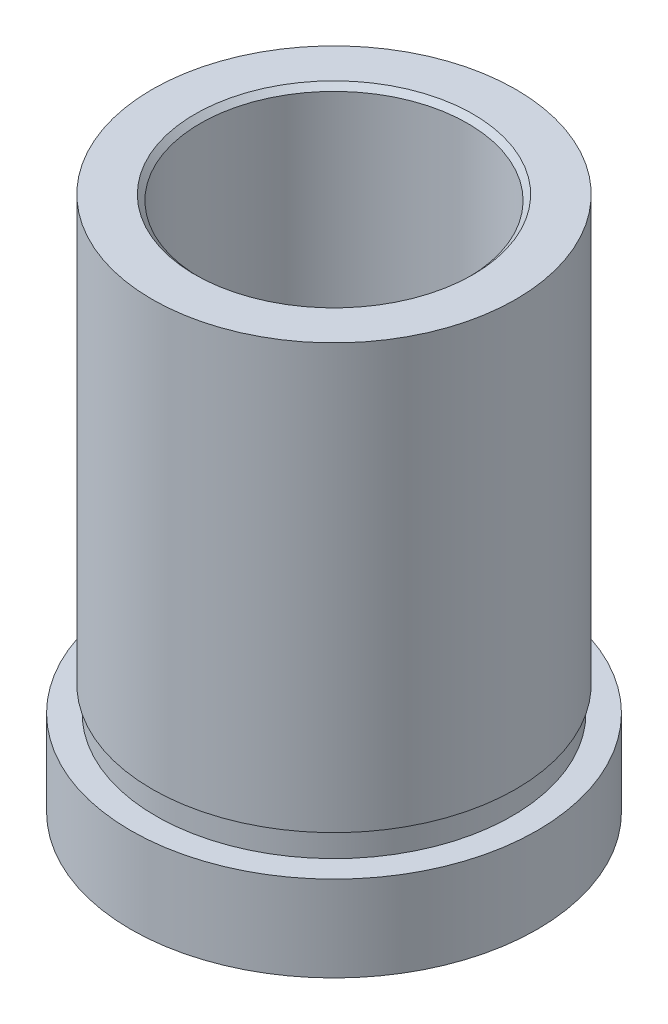
ISO-10303-21;
HEADER;
FILE_DESCRIPTION(('STEP AP214'),'2;1');
FILE_NAME('part.step','',(''),(''),'','','');
FILE_SCHEMA(('AUTOMOTIVE_DESIGN { 1 0 10303 214 1 1 1 1 }'));
ENDSEC;
DATA;
#1=APPLICATION_CONTEXT('core data for automotive mechanical design processes');
#2=APPLICATION_PROTOCOL_DEFINITION('international standard','automotive_design',2000,#1);
#3=PRODUCT_CONTEXT('',#1,'mechanical');
#4=PRODUCT('Part','Part','',(#3));
#5=PRODUCT_RELATED_PRODUCT_CATEGORY('part','',(#4));
#6=PRODUCT_DEFINITION_FORMATION('','',#4);
#7=PRODUCT_DEFINITION_CONTEXT('part definition',#1,'design');
#8=PRODUCT_DEFINITION('design','',#6,#7);
#9=PRODUCT_DEFINITION_SHAPE('','',#8);
#10=(LENGTH_UNIT() NAMED_UNIT(*) SI_UNIT(.MILLI.,.METRE.));
#11=(NAMED_UNIT(*) PLANE_ANGLE_UNIT() SI_UNIT($,.RADIAN.));
#12=(NAMED_UNIT(*) SI_UNIT($,.STERADIAN.) SOLID_ANGLE_UNIT());
#13=UNCERTAINTY_MEASURE_WITH_UNIT(LENGTH_MEASURE(1.E-05),#10,'distance_accuracy_value','');
#14=(GEOMETRIC_REPRESENTATION_CONTEXT(3) GLOBAL_UNCERTAINTY_ASSIGNED_CONTEXT((#13)) GLOBAL_UNIT_ASSIGNED_CONTEXT((#10,
#11,#12)) REPRESENTATION_CONTEXT('',''));
#15=CARTESIAN_POINT('',(0.,0.,0.));
#16=DIRECTION('',(0.,0.,1.));
#17=DIRECTION('',(1.,0.,0.));
#18=AXIS2_PLACEMENT_3D('',#15,#16,#17);
#19=CARTESIAN_POINT('',(0.,50.,0.));
#20=DIRECTION('',(0.,-1.,0.));
#21=DIRECTION('',(1.,0.,0.));
#22=AXIS2_PLACEMENT_3D('',#19,#20,#21);
#23=CYLINDRICAL_SURFACE('',#22,12.5);
#24=CARTESIAN_POINT('',(0.,49.5,0.));
#25=DIRECTION('',(0.,-1.,0.));
#26=DIRECTION('',(1.,0.,0.));
#27=AXIS2_PLACEMENT_3D('',#24,#25,#26);
#28=CIRCLE('',#27,12.5);
#29=CARTESIAN_POINT('',(12.5,49.5,0.));
#30=VERTEX_POINT('',#29);
#31=EDGE_CURVE('E10',#30,#30,#28,.F.);
#32=ORIENTED_EDGE('',*,*,#31,.T.);
#33=EDGE_LOOP('',(#32));
#34=FACE_BOUND('',#33,.T.);
#35=CARTESIAN_POINT('',(0.,16.,0.));
#36=DIRECTION('',(0.,-1.,0.));
#37=DIRECTION('',(1.,0.,0.));
#38=AXIS2_PLACEMENT_3D('',#35,#36,#37);
#39=CIRCLE('',#38,12.5);
#40=CARTESIAN_POINT('',(12.5,16.,0.));
#41=VERTEX_POINT('',#40);
#42=EDGE_CURVE('E65',#41,#41,#39,.F.);
#43=ORIENTED_EDGE('',*,*,#42,.F.);
#44=EDGE_LOOP('',(#43));
#45=FACE_BOUND('',#44,.T.);
#46=ADVANCED_FACE('F43',(#34,#45),#23,.F.);
#47=CARTESIAN_POINT('',(0.,0.,0.));
#48=DIRECTION('',(0.,1.,0.));
#49=DIRECTION('',(-1.,0.,0.));
#50=AXIS2_PLACEMENT_3D('',#47,#48,#49);
#51=PLANE('',#50);
#52=CARTESIAN_POINT('',(0.,0.,0.));
#53=DIRECTION('',(0.,1.,0.));
#54=DIRECTION('',(-1.,0.,0.));
#55=AXIS2_PLACEMENT_3D('',#52,#53,#54);
#56=CIRCLE('',#55,13.1);
#57=CARTESIAN_POINT('',(-13.1,0.,0.));
#58=VERTEX_POINT('',#57);
#59=EDGE_CURVE('E55',#58,#58,#56,.T.);
#60=ORIENTED_EDGE('',*,*,#59,.T.);
#61=EDGE_LOOP('',(#60));
#62=FACE_BOUND('',#61,.T.);
#63=CARTESIAN_POINT('',(0.,0.,0.));
#64=DIRECTION('',(0.,1.,0.));
#65=DIRECTION('',(-1.,0.,0.));
#66=AXIS2_PLACEMENT_3D('',#63,#64,#65);
#67=CIRCLE('',#66,19.);
#68=CARTESIAN_POINT('',(-19.,0.,0.));
#69=VERTEX_POINT('',#68);
#70=EDGE_CURVE('E64',#69,#69,#67,.T.);
#71=ORIENTED_EDGE('',*,*,#70,.F.);
#72=EDGE_LOOP('',(#71));
#73=FACE_BOUND('',#72,.T.);
#74=ADVANCED_FACE('F106',(#62,#73),#51,.F.);
#75=CARTESIAN_POINT('',(0.,50.,0.));
#76=DIRECTION('',(0.,1.,0.));
#77=DIRECTION('',(-1.,0.,0.));
#78=AXIS2_PLACEMENT_3D('',#75,#76,#77);
#79=CYLINDRICAL_SURFACE('',#78,19.);
#80=CARTESIAN_POINT('',(0.,8.,0.));
#81=DIRECTION('',(0.,1.,0.));
#82=DIRECTION('',(-1.,0.,0.));
#83=AXIS2_PLACEMENT_3D('',#80,#81,#82);
#84=CIRCLE('',#83,19.);
#85=CARTESIAN_POINT('',(-19.,8.,0.));
#86=VERTEX_POINT('',#85);
#87=EDGE_CURVE('E72',#86,#86,#84,.T.);
#88=ORIENTED_EDGE('',*,*,#87,.F.);
#89=EDGE_LOOP('',(#88));
#90=FACE_BOUND('',#89,.T.);
#91=ORIENTED_EDGE('',*,*,#70,.T.);
#92=EDGE_LOOP('',(#91));
#93=FACE_BOUND('',#92,.T.);
#94=ADVANCED_FACE('F110',(#90,#93),#79,.T.);
#95=CARTESIAN_POINT('',(19.,8.,0.));
#96=DIRECTION('',(0.,-1.,0.));
#97=DIRECTION('',(1.,0.,0.));
#98=AXIS2_PLACEMENT_3D('',#95,#96,#97);
#99=PLANE('',#98);
#100=CARTESIAN_POINT('',(0.,8.,0.));
#101=DIRECTION('',(0.,1.,0.));
#102=DIRECTION('',(-1.,0.,0.));
#103=AXIS2_PLACEMENT_3D('',#100,#101,#102);
#104=CIRCLE('',#103,16.65);
#105=CARTESIAN_POINT('',(-16.65,8.,0.));
#106=VERTEX_POINT('',#105);
#107=EDGE_CURVE('E75',#106,#106,#104,.T.);
#108=ORIENTED_EDGE('',*,*,#107,.F.);
#109=EDGE_LOOP('',(#108));
#110=FACE_BOUND('',#109,.T.);
#111=ORIENTED_EDGE('',*,*,#87,.T.);
#112=EDGE_LOOP('',(#111));
#113=FACE_BOUND('',#112,.T.);
#114=ADVANCED_FACE('F128',(#110,#113),#99,.F.);
#115=CARTESIAN_POINT('',(0.,50.,0.));
#116=DIRECTION('',(0.,1.,0.));
#117=DIRECTION('',(-1.,0.,0.));
#118=AXIS2_PLACEMENT_3D('',#115,#116,#117);
#119=CYLINDRICAL_SURFACE('',#118,16.65);
#120=CARTESIAN_POINT('',(0.,10.35,0.));
#121=DIRECTION('',(0.,1.,0.));
#122=DIRECTION('',(-1.,0.,0.));
#123=AXIS2_PLACEMENT_3D('',#120,#121,#122);
#124=CIRCLE('',#123,16.65);
#125=CARTESIAN_POINT('',(-16.65,10.35,0.));
#126=VERTEX_POINT('',#125);
#127=EDGE_CURVE('E78',#126,#126,#124,.T.);
#128=ORIENTED_EDGE('',*,*,#127,.F.);
#129=EDGE_LOOP('',(#128));
#130=FACE_BOUND('',#129,.T.);
#131=ORIENTED_EDGE('',*,*,#107,.T.);
#132=EDGE_LOOP('',(#131));
#133=FACE_BOUND('',#132,.T.);
#134=ADVANCED_FACE('F124',(#130,#133),#119,.T.);
#135=CARTESIAN_POINT('',(16.65,10.35,0.));
#136=DIRECTION('',(0.,1.,0.));
#137=DIRECTION('',(-1.,0.,0.));
#138=AXIS2_PLACEMENT_3D('',#135,#136,#137);
#139=PLANE('',#138);
#140=CARTESIAN_POINT('',(0.,10.35,0.));
#141=DIRECTION('',(0.,1.,0.));
#142=DIRECTION('',(-1.,0.,0.));
#143=AXIS2_PLACEMENT_3D('',#140,#141,#142);
#144=CIRCLE('',#143,17.);
#145=CARTESIAN_POINT('',(-17.,10.35,0.));
#146=VERTEX_POINT('',#145);
#147=EDGE_CURVE('E81',#146,#146,#144,.T.);
#148=ORIENTED_EDGE('',*,*,#147,.F.);
#149=EDGE_LOOP('',(#148));
#150=FACE_BOUND('',#149,.T.);
#151=ORIENTED_EDGE('',*,*,#127,.T.);
#152=EDGE_LOOP('',(#151));
#153=FACE_BOUND('',#152,.T.);
#154=ADVANCED_FACE('F120',(#150,#153),#139,.F.);
#155=CARTESIAN_POINT('',(0.,50.,0.));
#156=DIRECTION('',(0.,1.,0.));
#157=DIRECTION('',(-1.,0.,0.));
#158=AXIS2_PLACEMENT_3D('',#155,#156,#157);
#159=CYLINDRICAL_SURFACE('',#158,17.);
#160=CARTESIAN_POINT('',(0.,50.,0.));
#161=DIRECTION('',(0.,1.,0.));
#162=DIRECTION('',(-1.,0.,0.));
#163=AXIS2_PLACEMENT_3D('',#160,#161,#162);
#164=CIRCLE('',#163,17.);
#165=CARTESIAN_POINT('',(-17.,50.,0.));
#166=VERTEX_POINT('',#165);
#167=EDGE_CURVE('E68',#166,#166,#164,.T.);
#168=ORIENTED_EDGE('',*,*,#167,.F.);
#169=EDGE_LOOP('',(#168));
#170=FACE_BOUND('',#169,.T.);
#171=ORIENTED_EDGE('',*,*,#147,.T.);
#172=EDGE_LOOP('',(#171));
#173=FACE_BOUND('',#172,.T.);
#174=ADVANCED_FACE('F117',(#170,#173),#159,.T.);
#175=CARTESIAN_POINT('',(17.,50.,0.));
#176=DIRECTION('',(0.,-1.,0.));
#177=DIRECTION('',(1.,0.,0.));
#178=AXIS2_PLACEMENT_3D('',#175,#176,#177);
#179=PLANE('',#178);
#180=CARTESIAN_POINT('',(0.,50.,0.));
#181=DIRECTION('',(0.,-1.,0.));
#182=DIRECTION('',(1.,0.,0.));
#183=AXIS2_PLACEMENT_3D('',#180,#181,#182);
#184=CIRCLE('',#183,13.);
#185=CARTESIAN_POINT('',(13.,50.,0.));
#186=VERTEX_POINT('',#185);
#187=EDGE_CURVE('E51',#186,#186,#184,.T.);
#188=ORIENTED_EDGE('',*,*,#187,.T.);
#189=EDGE_LOOP('',(#188));
#190=FACE_BOUND('',#189,.T.);
#191=ORIENTED_EDGE('',*,*,#167,.T.);
#192=EDGE_LOOP('',(#191));
#193=FACE_BOUND('',#192,.T.);
#194=ADVANCED_FACE('F102',(#190,#193),#179,.F.);
#195=CARTESIAN_POINT('',(0.,16.,0.));
#196=DIRECTION('',(0.,-1.,0.));
#197=DIRECTION('',(1.,0.,0.));
#198=AXIS2_PLACEMENT_3D('',#195,#196,#197);
#199=PLANE('',#198);
#200=CARTESIAN_POINT('',(0.,16.,0.));
#201=DIRECTION('',(0.,-1.,0.));
#202=DIRECTION('',(1.,0.,0.));
#203=AXIS2_PLACEMENT_3D('',#200,#201,#202);
#204=CIRCLE('',#203,12.6);
#205=CARTESIAN_POINT('',(12.6,16.,0.));
#206=VERTEX_POINT('',#205);
#207=EDGE_CURVE('E69',#206,#206,#204,.T.);
#208=ORIENTED_EDGE('',*,*,#207,.T.);
#209=EDGE_LOOP('',(#208));
#210=FACE_BOUND('',#209,.T.);
#211=ORIENTED_EDGE('',*,*,#42,.T.);
#212=EDGE_LOOP('',(#211));
#213=FACE_BOUND('',#212,.T.);
#214=ADVANCED_FACE('F89',(#210,#213),#199,.T.);
#215=CARTESIAN_POINT('',(0.,16.,0.));
#216=DIRECTION('',(0.,-1.,0.));
#217=DIRECTION('',(1.,0.,0.));
#218=AXIS2_PLACEMENT_3D('',#215,#216,#217);
#219=CYLINDRICAL_SURFACE('',#218,12.6);
#220=CARTESIAN_POINT('',(0.,0.499999999999997,0.));
#221=DIRECTION('',(0.,1.,0.));
#222=DIRECTION('',(-1.,0.,0.));
#223=AXIS2_PLACEMENT_3D('',#220,#221,#222);
#224=CIRCLE('',#223,12.6);
#225=CARTESIAN_POINT('',(-12.6,0.499999999999997,0.));
#226=VERTEX_POINT('',#225);
#227=EDGE_CURVE('E59',#226,#226,#224,.F.);
#228=ORIENTED_EDGE('',*,*,#227,.T.);
#229=EDGE_LOOP('',(#228));
#230=FACE_BOUND('',#229,.T.);
#231=ORIENTED_EDGE('',*,*,#207,.F.);
#232=EDGE_LOOP('',(#231));
#233=FACE_BOUND('',#232,.T.);
#234=ADVANCED_FACE('F92',(#230,#233),#219,.F.);
#235=CARTESIAN_POINT('',(0.,0.499999999999997,0.));
#236=DIRECTION('',(0.,-1.,0.));
#237=DIRECTION('',(1.,0.,0.));
#238=AXIS2_PLACEMENT_3D('',#235,#236,#237);
#239=CONICAL_SURFACE('',#238,12.6,0.78539816339745);
#240=ORIENTED_EDGE('',*,*,#59,.F.);
#241=EDGE_LOOP('',(#240));
#242=FACE_BOUND('',#241,.T.);
#243=ORIENTED_EDGE('',*,*,#227,.F.);
#244=EDGE_LOOP('',(#243));
#245=FACE_BOUND('',#244,.T.);
#246=ADVANCED_FACE('F94',(#242,#245),#239,.F.);
#247=CARTESIAN_POINT('',(0.,50.,0.));
#248=DIRECTION('',(0.,1.,0.));
#249=DIRECTION('',(-1.,0.,0.));
#250=AXIS2_PLACEMENT_3D('',#247,#248,#249);
#251=CONICAL_SURFACE('',#250,13.,0.785398163397452);
#252=ORIENTED_EDGE('',*,*,#31,.F.);
#253=EDGE_LOOP('',(#252));
#254=FACE_BOUND('',#253,.T.);
#255=ORIENTED_EDGE('',*,*,#187,.F.);
#256=EDGE_LOOP('',(#255));
#257=FACE_BOUND('',#256,.T.);
#258=ADVANCED_FACE('F46',(#254,#257),#251,.F.);
#259=CLOSED_SHELL('',(#46,#74,#94,#114,#134,#154,#174,#194,#214,#234,#246,#258));
#260=MANIFOLD_SOLID_BREP('B2',#259);
#261=ADVANCED_BREP_SHAPE_REPRESENTATION('',(#18,#260),#14);
#262=SHAPE_DEFINITION_REPRESENTATION(#9,#261);
ENDSEC;
END-ISO-10303-21;
